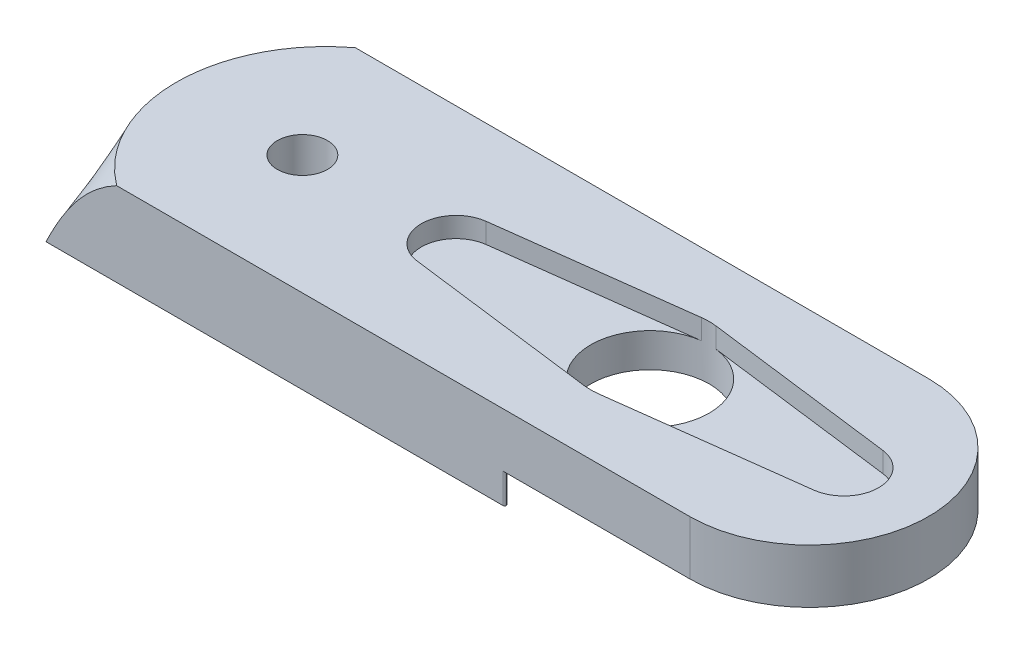
ISO-10303-21;
HEADER;
FILE_DESCRIPTION(('STEP AP214'),'2;1');
FILE_NAME('part.step','',(''),(''),'','','');
FILE_SCHEMA(('AUTOMOTIVE_DESIGN { 1 0 10303 214 1 1 1 1 }'));
ENDSEC;
DATA;
#1=APPLICATION_CONTEXT('core data for automotive mechanical design processes');
#2=APPLICATION_PROTOCOL_DEFINITION('international standard','automotive_design',2000,#1);
#3=PRODUCT_CONTEXT('',#1,'mechanical');
#4=PRODUCT('Part','Part','',(#3));
#5=PRODUCT_RELATED_PRODUCT_CATEGORY('part','',(#4));
#6=PRODUCT_DEFINITION_FORMATION('','',#4);
#7=PRODUCT_DEFINITION_CONTEXT('part definition',#1,'design');
#8=PRODUCT_DEFINITION('design','',#6,#7);
#9=PRODUCT_DEFINITION_SHAPE('','',#8);
#10=(LENGTH_UNIT() NAMED_UNIT(*) SI_UNIT(.MILLI.,.METRE.));
#11=(NAMED_UNIT(*) PLANE_ANGLE_UNIT() SI_UNIT($,.RADIAN.));
#12=(NAMED_UNIT(*) SI_UNIT($,.STERADIAN.) SOLID_ANGLE_UNIT());
#13=UNCERTAINTY_MEASURE_WITH_UNIT(LENGTH_MEASURE(1.E-05),#10,'distance_accuracy_value','');
#14=(GEOMETRIC_REPRESENTATION_CONTEXT(3) GLOBAL_UNCERTAINTY_ASSIGNED_CONTEXT((#13)) GLOBAL_UNIT_ASSIGNED_CONTEXT((#10,
#11,#12)) REPRESENTATION_CONTEXT('',''));
#15=CARTESIAN_POINT('',(0.,0.,0.));
#16=DIRECTION('',(0.,0.,1.));
#17=DIRECTION('',(1.,0.,0.));
#18=AXIS2_PLACEMENT_3D('',#15,#16,#17);
#19=CARTESIAN_POINT('',(30.8202954743875,49.190050083,-19.05));
#20=DIRECTION('',(0.,0.,-1.));
#21=DIRECTION('',(-1.,0.,0.));
#22=AXIS2_PLACEMENT_3D('',#19,#20,#21);
#23=PLANE('',#22);
#24=CARTESIAN_POINT('',(0.,53.499999934,-19.05));
#25=CARTESIAN_POINT('',(-0.142824092213235,53.4243099136071,-19.05));
#26=CARTESIAN_POINT('',(-0.283707079291157,53.3449592423254,-19.05));
#27=CARTESIAN_POINT('',(-0.560962515003241,53.1793399896116,-19.05));
#28=CARTESIAN_POINT('',(-0.697343456728937,53.093085626591,-19.05));
#29=CARTESIAN_POINT('',(-0.965393748981425,52.9138562119458,-19.05));
#30=CARTESIAN_POINT('',(-1.09706817879952,52.8208887539382,-19.05));
#31=CARTESIAN_POINT('',(-1.35557773518331,52.6285417561318,-19.05));
#32=CARTESIAN_POINT('',(-1.48241439864206,52.5291642801682,-19.05));
#33=CARTESIAN_POINT('',(-1.72837370541895,52.3266777041201,-19.05));
#34=CARTESIAN_POINT('',(-1.84760511643531,52.2237005275356,-19.05));
#35=CARTESIAN_POINT('',(-2.08131719091356,52.0124245604322,-19.05));
#36=CARTESIAN_POINT('',(-2.19579635012208,51.9041241082486,-19.05));
#37=CARTESIAN_POINT('',(-2.42002009735384,51.6826827511787,-19.05));
#38=CARTESIAN_POINT('',(-2.52976354570287,51.5695406940382,-19.05));
#39=CARTESIAN_POINT('',(-2.74457202709733,51.3389410931143,-19.05));
#40=CARTESIAN_POINT('',(-2.84963774970837,51.2214841900929,-19.05));
#41=CARTESIAN_POINT('',(-3.08832062881481,50.9443259062265,-19.05));
#42=CARTESIAN_POINT('',(-3.22026162322082,50.783179797612,-19.05));
#43=CARTESIAN_POINT('',(-3.47678619290874,50.4551306267397,-19.05));
#44=CARTESIAN_POINT('',(-3.60136892847071,50.2882269108567,-19.05));
#45=CARTESIAN_POINT('',(-3.8438216433234,49.9494502555842,-19.05));
#46=CARTESIAN_POINT('',(-3.9616868684627,49.7775739235255,-19.05));
#47=CARTESIAN_POINT('',(-4.19129330169751,49.4296103612051,-19.05));
#48=CARTESIAN_POINT('',(-4.30302994941141,49.2535201315792,-19.05));
#49=CARTESIAN_POINT('',(-4.52434376632393,48.8922586100192,-19.05));
#50=CARTESIAN_POINT('',(-4.6337396094512,48.7069765327379,-19.05));
#51=CARTESIAN_POINT('',(-4.84711835845197,48.3334551811599,-19.05));
#52=CARTESIAN_POINT('',(-4.95110399586638,48.1452174628676,-19.05));
#53=CARTESIAN_POINT('',(-5.1541276329912,47.766521970688,-19.05));
#54=CARTESIAN_POINT('',(-5.25317391493549,47.5760686221914,-19.05));
#55=CARTESIAN_POINT('',(-5.44671223556488,47.1936302337995,-19.05));
#56=CARTESIAN_POINT('',(-5.5412179275074,47.0016521115995,-19.05));
#57=CARTESIAN_POINT('',(-5.63387031773936,46.808800083,-19.05));
#58=B_SPLINE_CURVE_WITH_KNOTS('',3,(#24,#25,#26,#27,#28,#29,#30,#31,#32,#33,#34,#35,#36,#37,#38,
#39,#40,#41,#42,#43,#44,#45,#46,#47,#48,#49,#50,#51,#52,#53,#54,#55,#56,#57),.UNSPECIFIED.,.F.,
.F.,(4,2,2,2,2,2,2,2,2,2,2,2,2,2,2,2,4),(0.,0.484867849199377,0.968761594593897,
1.45211630135862,1.93531615169657,2.40778278099106,2.88039783950148,3.35312600818879,
3.82578425747352,4.45034902559084,5.07498493148202,5.70005755433242,6.32558916437343,
6.97098985747166,7.6160614696542,8.26001232106838,8.90188709440173),.UNSPECIFIED.);
#59=CARTESIAN_POINT('',(0.,53.499999934,-19.05000625));
#60=VERTEX_POINT('',#59);
#61=CARTESIAN_POINT('',(-5.63387031773936,46.808800083,-19.05));
#62=VERTEX_POINT('',#61);
#63=EDGE_CURVE('E248',#60,#62,#58,.T.);
#64=ORIENTED_EDGE('',*,*,#63,.F.);
#65=CARTESIAN_POINT('',(9.52500000000001,53.499999934,-19.05));
#66=DIRECTION('',(-1.,0.,0.));
#67=VECTOR('',#66,1.);
#68=LINE('',#65,#67);
#69=CARTESIAN_POINT('',(9.52500000000001,53.499999934,-19.05));
#70=VERTEX_POINT('',#69);
#71=EDGE_CURVE('E298',#70,#60,#68,.T.);
#72=ORIENTED_EDGE('',*,*,#71,.F.);
#73=DIRECTION('',(-1.,0.,0.));
#74=VECTOR('',#73,1.);
#75=CARTESIAN_POINT('',(0.,53.499999934,-19.05));
#76=LINE('',#75,#74);
#77=CARTESIAN_POINT('',(45.72,53.499999934,-19.05));
#78=VERTEX_POINT('',#77);
#79=EDGE_CURVE('E286',#78,#70,#76,.T.);
#80=ORIENTED_EDGE('',*,*,#79,.F.);
#81=DIRECTION('',(0.,1.,0.));
#82=VECTOR('',#81,1.);
#83=CARTESIAN_POINT('',(45.72,17.5367464310951,-19.05));
#84=LINE('',#83,#82);
#85=CARTESIAN_POINT('',(45.72,49.190050083,-19.05));
#86=VERTEX_POINT('',#85);
#87=EDGE_CURVE('E274',#86,#78,#84,.T.);
#88=ORIENTED_EDGE('',*,*,#87,.F.);
#89=DIRECTION('',(1.,0.,0.));
#90=VECTOR('',#89,1.);
#91=CARTESIAN_POINT('',(45.7200000000001,49.190050083,-19.05));
#92=LINE('',#91,#90);
#93=CARTESIAN_POINT('',(30.8202954743875,49.190050083,-19.05));
#94=VERTEX_POINT('',#93);
#95=EDGE_CURVE('E182',#94,#86,#92,.T.);
#96=ORIENTED_EDGE('',*,*,#95,.F.);
#97=DIRECTION('',(0.,-1.,0.));
#98=VECTOR('',#97,1.);
#99=CARTESIAN_POINT('',(30.8202954743875,53.499999934,-19.05));
#100=LINE('',#99,#98);
#101=CARTESIAN_POINT('',(30.8202954743875,46.808800083,-19.05));
#102=VERTEX_POINT('',#101);
#103=EDGE_CURVE('E257',#94,#102,#100,.T.);
#104=ORIENTED_EDGE('',*,*,#103,.T.);
#105=DIRECTION('',(-1.,0.,0.));
#106=VECTOR('',#105,1.);
#107=CARTESIAN_POINT('',(0.,46.808800083,-19.05));
#108=LINE('',#107,#106);
#109=EDGE_CURVE('E276',#102,#62,#108,.T.);
#110=ORIENTED_EDGE('',*,*,#109,.T.);
#111=EDGE_LOOP('',(#64,#72,#80,#88,#96,#104,#110));
#112=FACE_BOUND('',#111,.T.);
#113=ADVANCED_FACE('F37',(#112),#23,.T.);
#114=CARTESIAN_POINT('',(30.8492389549877,46.808800083,-0.250657894736843));
#115=DIRECTION('',(0.,-1.,0.));
#116=DIRECTION('',(0.,0.,-1.));
#117=AXIS2_PLACEMENT_3D('',#114,#115,#116);
#118=PLANE('',#117);
#119=CARTESIAN_POINT('',(5.29312945265254,46.808800083,-9.52499999999645));
#120=DIRECTION('',(0.,-1.,0.));
#121=DIRECTION('',(0.,0.,-1.));
#122=AXIS2_PLACEMENT_3D('',#119,#120,#121);
#123=CIRCLE('',#122,1.99999999999999);
#124=CARTESIAN_POINT('',(5.29312945265254,46.808800083,-11.5249999999964));
#125=VERTEX_POINT('',#124);
#126=EDGE_CURVE('E337',#125,#125,#123,.T.);
#127=ORIENTED_EDGE('',*,*,#126,.F.);
#128=EDGE_LOOP('',(#127));
#129=FACE_BOUND('',#128,.T.);
#130=CARTESIAN_POINT('',(-5.63387031774083,46.808800083,-19.0499999999929));
#131=CARTESIAN_POINT('',(-5.67883247737737,46.808800083,-18.8343207649077));
#132=CARTESIAN_POINT('',(-5.7222392338692,46.808800083,-18.6183172069429));
#133=CARTESIAN_POINT('',(-5.80593044232488,46.808800083,-18.1857153636521));
#134=CARTESIAN_POINT('',(-5.8462150237716,46.808800083,-17.9691171033758));
#135=CARTESIAN_POINT('',(-5.96237122104704,46.808800083,-17.3184979297653));
#136=CARTESIAN_POINT('',(-6.03354812702812,46.808800083,-16.8836390139528));
#137=CARTESIAN_POINT('',(-6.22862254336791,46.808800083,-15.5758904275822));
#138=CARTESIAN_POINT('',(-6.33399878041494,46.808800083,-14.700141879974));
#139=CARTESIAN_POINT('',(-6.45525488451322,46.808800083,-13.3831996168743));
#140=CARTESIAN_POINT('',(-6.48954142575201,46.808800083,-12.9435947651001));
#141=CARTESIAN_POINT('',(-6.54577760202832,46.808800083,-12.0635798021005));
#142=CARTESIAN_POINT('',(-6.56772730798943,46.808800083,-11.6231696955191));
#143=CARTESIAN_POINT('',(-6.59892844138822,46.808800083,-10.7493110819962));
#144=CARTESIAN_POINT('',(-6.60838697770993,46.808800083,-10.3158699037701));
#145=CARTESIAN_POINT('',(-6.61508391249123,46.808800083,-9.44889409386989));
#146=CARTESIAN_POINT('',(-6.61232236883656,46.808800083,-9.01535946264814));
#147=CARTESIAN_POINT('',(-6.59467434613991,46.808800083,-8.14867150898365));
#148=CARTESIAN_POINT('',(-6.57979168922646,46.808800083,-7.71551810942384));
#149=CARTESIAN_POINT('',(-6.5380627319321,46.808800083,-6.8497994708474));
#150=CARTESIAN_POINT('',(-6.51121628631656,46.808800083,-6.41723423903479));
#151=CARTESIAN_POINT('',(-6.41289546306449,46.808800083,-5.12139693856703));
#152=CARTESIAN_POINT('',(-6.32362717951879,46.808800083,-4.25938646392952));
#153=CARTESIAN_POINT('',(-6.13573923356415,46.808800083,-2.83155746163193));
#154=CARTESIAN_POINT('',(-6.05043799307968,46.808800083,-2.26393838898869));
#155=CARTESIAN_POINT('',(-5.85835889334025,46.808800083,-1.13014111844092));
#156=CARTESIAN_POINT('',(-5.75150108370354,46.808800083,-0.563976473994279));
#157=CARTESIAN_POINT('',(-5.63387031773935,46.808800083,0.));
#158=B_SPLINE_CURVE_WITH_KNOTS('',3,(#130,#131,#132,#133,#134,#135,#136,#137,#138,#139,#140,
#141,#142,#143,#144,#145,#146,#147,#148,#149,#150,#151,#152,#153,#154,#155,#156,#157),
.UNSPECIFIED.,.F.,.F.,(4,2,2,2,2,2,2,2,2,2,2,2,2,4),(0.,0.660942325679882,1.32185722607055,
2.64364533774028,5.28817912422191,6.61087087355802,7.9335550187546,9.23402106828043,
10.5344809575879,11.834530933945,13.1345966927138,15.7329397607394,17.4545617030089,
19.1826903498687),.UNSPECIFIED.);
#159=CARTESIAN_POINT('',(-5.63387031773935,46.808800083,0.));
#160=VERTEX_POINT('',#159);
#161=EDGE_CURVE('E44',#62,#160,#158,.T.);
#162=ORIENTED_EDGE('',*,*,#161,.F.);
#163=ORIENTED_EDGE('',*,*,#109,.F.);
#164=CARTESIAN_POINT('',(30.8202954743875,46.808800083,-18.923));
#165=DIRECTION('',(0.,1.,0.));
#166=DIRECTION('',(0.,0.,1.));
#167=AXIS2_PLACEMENT_3D('',#164,#165,#166);
#168=CIRCLE('',#167,0.127);
#169=CARTESIAN_POINT('',(30.8492389549877,46.808800083,-18.7993421052632));
#170=VERTEX_POINT('',#169);
#171=EDGE_CURVE('E266',#102,#170,#168,.F.);
#172=ORIENTED_EDGE('',*,*,#171,.T.);
#173=CARTESIAN_POINT('',(33.02,46.808800083,-9.525));
#174=DIRECTION('',(0.,-1.,0.));
#175=DIRECTION('',(0.,0.,-1.));
#176=AXIS2_PLACEMENT_3D('',#173,#174,#175);
#177=CIRCLE('',#176,9.525);
#178=CARTESIAN_POINT('',(30.8492389549877,46.808800083,-0.250657894736843));
#179=VERTEX_POINT('',#178);
#180=EDGE_CURVE('E11',#179,#170,#177,.T.);
#181=ORIENTED_EDGE('',*,*,#180,.F.);
#182=CARTESIAN_POINT('',(30.8202954743875,46.808800083,-0.127));
#183=DIRECTION('',(0.,1.,0.));
#184=DIRECTION('',(0.,0.,1.));
#185=AXIS2_PLACEMENT_3D('',#182,#183,#184);
#186=CIRCLE('',#185,0.127);
#187=CARTESIAN_POINT('',(30.8202954743875,46.808800083,0.));
#188=VERTEX_POINT('',#187);
#189=EDGE_CURVE('E263',#179,#188,#186,.F.);
#190=ORIENTED_EDGE('',*,*,#189,.T.);
#191=DIRECTION('',(-1.,0.,0.));
#192=VECTOR('',#191,1.);
#193=CARTESIAN_POINT('',(9.52500000000001,46.808800083,0.));
#194=LINE('',#193,#192);
#195=EDGE_CURVE('E270',#188,#160,#194,.T.);
#196=ORIENTED_EDGE('',*,*,#195,.T.);
#197=EDGE_LOOP('',(#162,#163,#172,#181,#190,#196));
#198=FACE_BOUND('',#197,.T.);
#199=ADVANCED_FACE('F209',(#129,#198),#118,.T.);
#200=CARTESIAN_POINT('',(30.8202954743875,46.808800083,0.));
#201=DIRECTION('',(0.,0.,1.));
#202=DIRECTION('',(1.,0.,0.));
#203=AXIS2_PLACEMENT_3D('',#200,#201,#202);
#204=PLANE('',#203);
#205=CARTESIAN_POINT('',(-5.63387031773935,46.808800083,0.));
#206=CARTESIAN_POINT('',(-5.53368623342911,47.0173194216757,0.));
#207=CARTESIAN_POINT('',(-5.43133904949095,47.2248225493173,0.));
#208=CARTESIAN_POINT('',(-5.22118450448037,47.6382502946474,0.));
#209=CARTESIAN_POINT('',(-5.11335407463031,47.8441631694407,0.));
#210=CARTESIAN_POINT('',(-4.89173540748727,48.2534398914354,0.));
#211=CARTESIAN_POINT('',(-4.77793286482719,48.4567960230483,0.));
#212=CARTESIAN_POINT('',(-4.54377645964704,48.8599218997045,0.));
#213=CARTESIAN_POINT('',(-4.42341765326063,49.0596887829434,0.));
#214=CARTESIAN_POINT('',(-4.17970761623702,49.4478390488748,0.));
#215=CARTESIAN_POINT('',(-4.05660369198403,49.6363772166557,0.));
#216=CARTESIAN_POINT('',(-3.80299038255778,50.0081230115674,0.));
#217=CARTESIAN_POINT('',(-3.67248926261061,50.1913362551151,0.));
#218=CARTESIAN_POINT('',(-3.40337004968078,50.5513975944051,0.));
#219=CARTESIAN_POINT('',(-3.26476131913839,50.7282526655302,0.));
#220=CARTESIAN_POINT('',(-2.97866831428998,51.0745503730093,0.));
#221=CARTESIAN_POINT('',(-2.83118784038601,51.2439961303357,0.));
#222=CARTESIAN_POINT('',(-2.58361637519331,51.5125736126757,0.));
#223=CARTESIAN_POINT('',(-2.4863807241827,51.6143461819171,0.));
#224=CARTESIAN_POINT('',(-2.28810406081744,51.8141640571713,0.));
#225=CARTESIAN_POINT('',(-2.18706230032587,51.9122086227089,0.));
#226=CARTESIAN_POINT('',(-1.98116639864321,52.1041941303412,0.));
#227=CARTESIAN_POINT('',(-1.87631260612272,52.1981354460212,0.));
#228=CARTESIAN_POINT('',(-1.66281613362787,52.3815771135582,0.));
#229=CARTESIAN_POINT('',(-1.55417408702983,52.4710782017928,0.));
#230=CARTESIAN_POINT('',(-1.33080440943543,52.6472002415046,0.));
#231=CARTESIAN_POINT('',(-1.21599649907271,52.7337194864537,0.));
#232=CARTESIAN_POINT('',(-0.982599180787647,52.9015492756301,0.));
#233=CARTESIAN_POINT('',(-0.864009050846323,52.9828588163116,0.));
#234=CARTESIAN_POINT('',(-0.623178079485868,53.1400655913847,0.));
#235=CARTESIAN_POINT('',(-0.500934804689872,53.2159590987419,0.));
#236=CARTESIAN_POINT('',(-0.252976096687141,53.3622063021313,0.));
#237=CARTESIAN_POINT('',(-0.127256590006545,53.432553091652,0.));
#238=CARTESIAN_POINT('',(0.,53.499999934,0.));
#239=B_SPLINE_CURVE_WITH_KNOTS('',3,(#205,#206,#207,#208,#209,#210,#211,#212,#213,#214,#215,
#216,#217,#218,#219,#220,#221,#222,#223,#224,#225,#226,#227,#228,#229,#230,#231,#232,#233,#234,
#235,#236,#237,#238),.UNSPECIFIED.,.F.,.F.,(4,2,2,2,2,2,2,2,2,2,2,2,2,2,2,2,4),(0.,
0.694032087665056,1.39127480086992,2.09027153439872,2.78980285867784,3.46515019268505,
4.13975726096967,4.81360012879346,5.48715636915705,5.90933847295858,6.33160399928932,
6.75383099945394,7.17598774080865,7.607120888115,8.038336836487,8.46984671973751,
8.90188568151876),.UNSPECIFIED.);
#240=CARTESIAN_POINT('',(0.,53.499999934,0.));
#241=VERTEX_POINT('',#240);
#242=EDGE_CURVE('E245',#160,#241,#239,.T.);
#243=ORIENTED_EDGE('',*,*,#242,.F.);
#244=ORIENTED_EDGE('',*,*,#195,.F.);
#245=DIRECTION('',(0.,-1.,0.));
#246=VECTOR('',#245,1.);
#247=CARTESIAN_POINT('',(30.8202954743875,53.499999934,0.));
#248=LINE('',#247,#246);
#249=CARTESIAN_POINT('',(30.8202954743875,49.190050083,0.));
#250=VERTEX_POINT('',#249);
#251=EDGE_CURVE('E260',#188,#250,#248,.F.);
#252=ORIENTED_EDGE('',*,*,#251,.T.);
#253=DIRECTION('',(-1.,0.,0.));
#254=VECTOR('',#253,1.);
#255=CARTESIAN_POINT('',(45.72,49.190050083,0.));
#256=LINE('',#255,#254);
#257=CARTESIAN_POINT('',(45.72,49.190050083,0.));
#258=VERTEX_POINT('',#257);
#259=EDGE_CURVE('E187',#258,#250,#256,.T.);
#260=ORIENTED_EDGE('',*,*,#259,.F.);
#261=DIRECTION('',(0.,1.,0.));
#262=VECTOR('',#261,1.);
#263=CARTESIAN_POINT('',(45.72,17.5367464310951,0.));
#264=LINE('',#263,#262);
#265=CARTESIAN_POINT('',(45.72,53.499999934,0.));
#266=VERTEX_POINT('',#265);
#267=EDGE_CURVE('E290',#258,#266,#264,.T.);
#268=ORIENTED_EDGE('',*,*,#267,.T.);
#269=DIRECTION('',(1.,0.,0.));
#270=VECTOR('',#269,1.);
#271=CARTESIAN_POINT('',(0.,53.499999934,0.));
#272=LINE('',#271,#270);
#273=CARTESIAN_POINT('',(9.52500000000001,53.499999934,0.));
#274=VERTEX_POINT('',#273);
#275=EDGE_CURVE('E275',#274,#266,#272,.T.);
#276=ORIENTED_EDGE('',*,*,#275,.F.);
#277=CARTESIAN_POINT('',(9.52500000000001,53.499999934,0.));
#278=DIRECTION('',(-1.,0.,0.));
#279=VECTOR('',#278,1.);
#280=LINE('',#277,#279);
#281=EDGE_CURVE('E242',#274,#241,#280,.T.);
#282=ORIENTED_EDGE('',*,*,#281,.T.);
#283=EDGE_LOOP('',(#243,#244,#252,#260,#268,#276,#282));
#284=FACE_BOUND('',#283,.T.);
#285=ADVANCED_FACE('F212',(#284),#204,.T.);
#286=CARTESIAN_POINT('',(48.8380781067962,54.0240628376615,-6.77570559819935));
#287=DIRECTION('',(0.126213592233009,0.,0.992003089277266));
#288=DIRECTION('',(0.,-1.,0.));
#289=AXIS2_PLACEMENT_3D('',#286,#287,#288);
#290=PLANE('',#289);
#291=DIRECTION('',(0.992003089277266,0.,-0.126213592233009));
#292=VECTOR('',#291,1.);
#293=CARTESIAN_POINT('',(33.6162033495146,53.499999934,-4.83901052698018));
#294=LINE('',#293,#292);
#295=CARTESIAN_POINT('',(33.6162033495146,53.499999934,-4.83901052698018));
#296=VERTEX_POINT('',#295);
#297=CARTESIAN_POINT('',(48.8380781067962,53.499999934,-6.77570559819935));
#298=VERTEX_POINT('',#297);
#299=EDGE_CURVE('E355',#296,#298,#294,.T.);
#300=ORIENTED_EDGE('',*,*,#299,.T.);
#301=DIRECTION('',(0.,-1.,0.));
#302=VECTOR('',#301,1.);
#303=CARTESIAN_POINT('',(48.8380781067962,54.0240628376615,-6.77570559819935));
#304=LINE('',#303,#302);
#305=CARTESIAN_POINT('',(48.8380781067962,51.8942728376614,-6.77570559819935));
#306=VERTEX_POINT('',#305);
#307=EDGE_CURVE('E136',#298,#306,#304,.T.);
#308=ORIENTED_EDGE('',*,*,#307,.T.);
#309=DIRECTION('',(-0.992003089277266,0.,0.126213592233009));
#310=VECTOR('',#309,1.);
#311=CARTESIAN_POINT('',(33.6162033495146,51.8942728376615,-4.83901052698018));
#312=LINE('',#311,#310);
#313=CARTESIAN_POINT('',(33.6162033495146,51.8942728376615,-4.83901052698018));
#314=VERTEX_POINT('',#313);
#315=EDGE_CURVE('E116',#306,#314,#312,.T.);
#316=ORIENTED_EDGE('',*,*,#315,.T.);
#317=DIRECTION('',(0.,-1.,0.));
#318=VECTOR('',#317,1.);
#319=CARTESIAN_POINT('',(33.6162033495146,52.4130678376615,-4.83901052698018));
#320=LINE('',#319,#318);
#321=EDGE_CURVE('E126',#296,#314,#320,.T.);
#322=ORIENTED_EDGE('',*,*,#321,.F.);
#323=EDGE_LOOP('',(#300,#308,#316,#322));
#324=FACE_BOUND('',#323,.T.);
#325=ADVANCED_FACE('F139',(#324),#290,.F.);
#326=CARTESIAN_POINT('',(48.4882825,54.0240628376615,-9.52499999999998));
#327=DIRECTION('',(0.,-1.,0.));
#328=DIRECTION('',(0.126213592233009,0.,0.992003089277266));
#329=AXIS2_PLACEMENT_3D('',#326,#327,#328);
#330=CYLINDRICAL_SURFACE('',#329,2.7714575);
#331=CARTESIAN_POINT('',(48.4882825,53.499999934,-9.52499999999998));
#332=DIRECTION('',(0.,1.,0.));
#333=DIRECTION('',(0.,0.,1.));
#334=AXIS2_PLACEMENT_3D('',#331,#332,#333);
#335=CIRCLE('',#334,2.7714575);
#336=CARTESIAN_POINT('',(48.8380781067961,53.499999934,-12.2742944018006));
#337=VERTEX_POINT('',#336);
#338=EDGE_CURVE('E354',#298,#337,#335,.T.);
#339=ORIENTED_EDGE('',*,*,#338,.T.);
#340=DIRECTION('',(0.,-1.,0.));
#341=VECTOR('',#340,1.);
#342=CARTESIAN_POINT('',(48.8380781067961,54.0240628376615,-12.2742944018006));
#343=LINE('',#342,#341);
#344=CARTESIAN_POINT('',(48.8380781067961,51.8942728376614,-12.2742944018006));
#345=VERTEX_POINT('',#344);
#346=EDGE_CURVE('E152',#337,#345,#343,.T.);
#347=ORIENTED_EDGE('',*,*,#346,.T.);
#348=CARTESIAN_POINT('',(48.4882825,51.8942728376614,-9.52499999999998));
#349=DIRECTION('',(0.,-1.,0.));
#350=DIRECTION('',(0.126213592233009,0.,0.992003089277266));
#351=AXIS2_PLACEMENT_3D('',#348,#349,#350);
#352=CIRCLE('',#351,2.7714575);
#353=EDGE_CURVE('E142',#345,#306,#352,.T.);
#354=ORIENTED_EDGE('',*,*,#353,.T.);
#355=ORIENTED_EDGE('',*,*,#307,.F.);
#356=EDGE_LOOP('',(#339,#347,#354,#355));
#357=FACE_BOUND('',#356,.T.);
#358=ADVANCED_FACE('F415',(#357),#330,.F.);
#359=CARTESIAN_POINT('',(33.02,51.8942728376615,-9.525));
#360=DIRECTION('',(0.,1.,0.));
#361=DIRECTION('',(0.,0.,-1.));
#362=AXIS2_PLACEMENT_3D('',#359,#360,#361);
#363=PLANE('',#362);
#364=ORIENTED_EDGE('',*,*,#315,.F.);
#365=ORIENTED_EDGE('',*,*,#353,.F.);
#366=DIRECTION('',(0.992003089277266,0.,0.126213592233011));
#367=VECTOR('',#366,1.);
#368=CARTESIAN_POINT('',(48.8380781067961,51.8942728376614,-12.2742944018006));
#369=LINE('',#368,#367);
#370=CARTESIAN_POINT('',(33.6162033495146,51.8942728376615,-14.2109894730198));
#371=VERTEX_POINT('',#370);
#372=EDGE_CURVE('E118',#371,#345,#369,.T.);
#373=ORIENTED_EDGE('',*,*,#372,.F.);
#374=CARTESIAN_POINT('',(33.02,51.8942728376615,-9.525));
#375=DIRECTION('',(0.,-1.,0.));
#376=DIRECTION('',(-1.,0.,0.));
#377=AXIS2_PLACEMENT_3D('',#374,#375,#376);
#378=CIRCLE('',#377,4.723765);
#379=EDGE_CURVE('E111',#371,#314,#378,.T.);
#380=ORIENTED_EDGE('',*,*,#379,.T.);
#381=EDGE_LOOP('',(#364,#365,#373,#380));
#382=FACE_BOUND('',#381,.T.);
#383=ADVANCED_FACE('F113',(#382),#363,.T.);
#384=CARTESIAN_POINT('',(17.2019218932039,54.0240628376615,-12.2742944018007));
#385=DIRECTION('',(-0.126213592233009,0.,-0.992003089277266));
#386=DIRECTION('',(0.,1.,0.));
#387=AXIS2_PLACEMENT_3D('',#384,#385,#386);
#388=PLANE('',#387);
#389=DIRECTION('',(-0.992003089277266,0.,0.126213592233009));
#390=VECTOR('',#389,1.);
#391=CARTESIAN_POINT('',(32.4237966504854,53.499999934,-14.2109894730198));
#392=LINE('',#391,#390);
#393=CARTESIAN_POINT('',(32.4237966504855,53.499999934,-14.2109894730198));
#394=VERTEX_POINT('',#393);
#395=CARTESIAN_POINT('',(17.2019218932039,53.499999934,-12.2742944018007));
#396=VERTEX_POINT('',#395);
#397=EDGE_CURVE('E372',#394,#396,#392,.T.);
#398=ORIENTED_EDGE('',*,*,#397,.T.);
#399=DIRECTION('',(0.,-1.,0.));
#400=VECTOR('',#399,1.);
#401=CARTESIAN_POINT('',(17.2019218932039,54.0240628376615,-12.2742944018007));
#402=LINE('',#401,#400);
#403=CARTESIAN_POINT('',(17.2019218932039,51.8942728376615,-12.2742944018007));
#404=VERTEX_POINT('',#403);
#405=EDGE_CURVE('E171',#396,#404,#402,.T.);
#406=ORIENTED_EDGE('',*,*,#405,.T.);
#407=DIRECTION('',(0.992003089277266,0.,-0.126213592233009));
#408=VECTOR('',#407,1.);
#409=CARTESIAN_POINT('',(32.4237966504855,51.8942728376615,-14.2109894730198));
#410=LINE('',#409,#408);
#411=CARTESIAN_POINT('',(32.4237966504855,51.8942728376615,-14.2109894730198));
#412=VERTEX_POINT('',#411);
#413=EDGE_CURVE('E122',#404,#412,#410,.T.);
#414=ORIENTED_EDGE('',*,*,#413,.T.);
#415=DIRECTION('',(0.,-1.,0.));
#416=VECTOR('',#415,1.);
#417=CARTESIAN_POINT('',(32.4237966504855,52.4130678376615,-14.2109894730198));
#418=LINE('',#417,#416);
#419=EDGE_CURVE('E149',#394,#412,#418,.T.);
#420=ORIENTED_EDGE('',*,*,#419,.F.);
#421=EDGE_LOOP('',(#398,#406,#414,#420));
#422=FACE_BOUND('',#421,.T.);
#423=ADVANCED_FACE('F420',(#422),#388,.F.);
#424=CARTESIAN_POINT('',(17.5517175,54.0240628376615,-9.52500000000002));
#425=DIRECTION('',(0.,-1.,0.));
#426=DIRECTION('',(-0.126213592233009,0.,-0.992003089277266));
#427=AXIS2_PLACEMENT_3D('',#424,#425,#426);
#428=CYLINDRICAL_SURFACE('',#427,2.7714575);
#429=CARTESIAN_POINT('',(17.5517175,53.499999934,-9.52500000000002));
#430=DIRECTION('',(0.,1.,0.));
#431=DIRECTION('',(0.,0.,1.));
#432=AXIS2_PLACEMENT_3D('',#429,#430,#431);
#433=CIRCLE('',#432,2.7714575);
#434=CARTESIAN_POINT('',(17.2019218932039,53.499999934,-6.77570559819936));
#435=VERTEX_POINT('',#434);
#436=EDGE_CURVE('E375',#396,#435,#433,.T.);
#437=ORIENTED_EDGE('',*,*,#436,.T.);
#438=DIRECTION('',(0.,-1.,0.));
#439=VECTOR('',#438,1.);
#440=CARTESIAN_POINT('',(17.2019218932039,54.0240628376615,-6.77570559819936));
#441=LINE('',#440,#439);
#442=CARTESIAN_POINT('',(17.2019218932039,51.8942728376615,-6.77570559819936));
#443=VERTEX_POINT('',#442);
#444=EDGE_CURVE('E170',#435,#443,#441,.T.);
#445=ORIENTED_EDGE('',*,*,#444,.T.);
#446=CARTESIAN_POINT('',(17.5517175,51.8942728376615,-9.52500000000002));
#447=DIRECTION('',(0.,-1.,0.));
#448=DIRECTION('',(-0.126213592233009,0.,-0.992003089277266));
#449=AXIS2_PLACEMENT_3D('',#446,#447,#448);
#450=CIRCLE('',#449,2.7714575);
#451=EDGE_CURVE('E156',#443,#404,#450,.T.);
#452=ORIENTED_EDGE('',*,*,#451,.T.);
#453=ORIENTED_EDGE('',*,*,#405,.F.);
#454=EDGE_LOOP('',(#437,#445,#452,#453));
#455=FACE_BOUND('',#454,.T.);
#456=ADVANCED_FACE('F427',(#455),#428,.F.);
#457=CARTESIAN_POINT('',(33.02,51.8942728376615,-9.525));
#458=DIRECTION('',(0.,1.,0.));
#459=DIRECTION('',(0.,0.,-1.));
#460=AXIS2_PLACEMENT_3D('',#457,#458,#459);
#461=PLANE('',#460);
#462=CARTESIAN_POINT('',(33.02,51.8942728376615,-9.525));
#463=DIRECTION('',(0.,-1.,0.));
#464=DIRECTION('',(-1.,0.,0.));
#465=AXIS2_PLACEMENT_3D('',#462,#463,#464);
#466=CIRCLE('',#465,4.723765);
#467=CARTESIAN_POINT('',(32.4237966504855,51.8942728376615,-4.83901052698018));
#468=VERTEX_POINT('',#467);
#469=EDGE_CURVE('E103',#468,#412,#466,.T.);
#470=ORIENTED_EDGE('',*,*,#469,.T.);
#471=ORIENTED_EDGE('',*,*,#413,.F.);
#472=ORIENTED_EDGE('',*,*,#451,.F.);
#473=DIRECTION('',(-0.992003089277266,0.,-0.126213592233011));
#474=VECTOR('',#473,1.);
#475=CARTESIAN_POINT('',(17.2019218932039,51.8942728376615,-6.77570559819936));
#476=LINE('',#475,#474);
#477=EDGE_CURVE('E159',#468,#443,#476,.T.);
#478=ORIENTED_EDGE('',*,*,#477,.F.);
#479=EDGE_LOOP('',(#470,#471,#472,#478));
#480=FACE_BOUND('',#479,.T.);
#481=ADVANCED_FACE('F431',(#480),#461,.T.);
#482=CARTESIAN_POINT('',(33.02,52.4130678376615,-9.525));
#483=DIRECTION('',(0.,-1.,0.));
#484=DIRECTION('',(-1.,0.,0.));
#485=AXIS2_PLACEMENT_3D('',#482,#483,#484);
#486=CYLINDRICAL_SURFACE('',#485,4.723765);
#487=CARTESIAN_POINT('',(33.02,53.499999934,-9.525));
#488=DIRECTION('',(0.,1.,0.));
#489=DIRECTION('',(0.,0.,1.));
#490=AXIS2_PLACEMENT_3D('',#487,#488,#489);
#491=CIRCLE('',#490,4.723765);
#492=CARTESIAN_POINT('',(33.6162033495146,53.499999934,-14.2109894730198));
#493=VERTEX_POINT('',#492);
#494=EDGE_CURVE('E365',#493,#394,#491,.T.);
#495=ORIENTED_EDGE('',*,*,#494,.T.);
#496=ORIENTED_EDGE('',*,*,#419,.T.);
#497=ORIENTED_EDGE('',*,*,#469,.F.);
#498=DIRECTION('',(0.,-1.,0.));
#499=VECTOR('',#498,1.);
#500=CARTESIAN_POINT('',(32.4237966504855,52.4130678376615,-4.83901052698018));
#501=LINE('',#500,#499);
#502=CARTESIAN_POINT('',(32.4237966504855,53.499999934,-4.83901052698018));
#503=VERTEX_POINT('',#502);
#504=EDGE_CURVE('E74',#503,#468,#501,.T.);
#505=ORIENTED_EDGE('',*,*,#504,.F.);
#506=EDGE_CURVE('E131',#503,#296,#491,.T.);
#507=ORIENTED_EDGE('',*,*,#506,.T.);
#508=ORIENTED_EDGE('',*,*,#321,.T.);
#509=ORIENTED_EDGE('',*,*,#379,.F.);
#510=DIRECTION('',(0.,-1.,0.));
#511=VECTOR('',#510,1.);
#512=CARTESIAN_POINT('',(33.6162033495146,52.4130678376615,-14.2109894730198));
#513=LINE('',#512,#511);
#514=EDGE_CURVE('E162',#493,#371,#513,.T.);
#515=ORIENTED_EDGE('',*,*,#514,.F.);
#516=EDGE_LOOP('',(#495,#496,#497,#505,#507,#508,#509,#515));
#517=FACE_BOUND('',#516,.T.);
#518=CARTESIAN_POINT('',(33.02,49.190050083,-9.525));
#519=DIRECTION('',(0.,-1.,0.));
#520=DIRECTION('',(0.,0.,-1.));
#521=AXIS2_PLACEMENT_3D('',#518,#519,#520);
#522=CIRCLE('',#521,4.723765);
#523=CARTESIAN_POINT('',(33.02,49.190050083,-14.248765));
#524=VERTEX_POINT('',#523);
#525=EDGE_CURVE('E179',#524,#524,#522,.F.);
#526=ORIENTED_EDGE('',*,*,#525,.F.);
#527=EDGE_LOOP('',(#526));
#528=FACE_BOUND('',#527,.T.);
#529=ADVANCED_FACE('F128',(#517,#528),#486,.F.);
#530=CARTESIAN_POINT('',(45.72,17.5367464310951,-9.525));
#531=DIRECTION('',(0.,1.,0.));
#532=DIRECTION('',(0.,0.,1.));
#533=AXIS2_PLACEMENT_3D('',#530,#531,#532);
#534=CYLINDRICAL_SURFACE('',#533,9.525);
#535=ORIENTED_EDGE('',*,*,#267,.F.);
#536=CARTESIAN_POINT('',(45.72,49.190050083,-9.525));
#537=DIRECTION('',(0.,-1.,0.));
#538=DIRECTION('',(0.,0.,-1.));
#539=AXIS2_PLACEMENT_3D('',#536,#537,#538);
#540=CIRCLE('',#539,9.525);
#541=EDGE_CURVE('E54',#86,#258,#540,.T.);
#542=ORIENTED_EDGE('',*,*,#541,.F.);
#543=ORIENTED_EDGE('',*,*,#87,.T.);
#544=CARTESIAN_POINT('',(45.72,53.499999934,-9.525));
#545=DIRECTION('',(0.,1.,0.));
#546=DIRECTION('',(0.,0.,-1.));
#547=AXIS2_PLACEMENT_3D('',#544,#545,#546);
#548=CIRCLE('',#547,9.525);
#549=EDGE_CURVE('E293',#266,#78,#548,.T.);
#550=ORIENTED_EDGE('',*,*,#549,.F.);
#551=EDGE_LOOP('',(#535,#542,#543,#550));
#552=FACE_BOUND('',#551,.T.);
#553=ADVANCED_FACE('F394',(#552),#534,.T.);
#554=CARTESIAN_POINT('',(33.02,49.190050083,-9.525));
#555=DIRECTION('',(0.,-1.,0.));
#556=DIRECTION('',(0.,0.,-1.));
#557=AXIS2_PLACEMENT_3D('',#554,#555,#556);
#558=CYLINDRICAL_SURFACE('',#557,9.525);
#559=CARTESIAN_POINT('',(33.02,49.190050083,-9.525));
#560=DIRECTION('',(0.,-1.,0.));
#561=DIRECTION('',(0.,0.,-1.));
#562=AXIS2_PLACEMENT_3D('',#559,#560,#561);
#563=CIRCLE('',#562,9.525);
#564=CARTESIAN_POINT('',(30.8492389549877,49.190050083,-0.250657894736843));
#565=VERTEX_POINT('',#564);
#566=CARTESIAN_POINT('',(30.8492389549877,49.190050083,-18.7993421052632));
#567=VERTEX_POINT('',#566);
#568=EDGE_CURVE('E184',#565,#567,#563,.T.);
#569=ORIENTED_EDGE('',*,*,#568,.F.);
#570=DIRECTION('',(0.,-1.,0.));
#571=VECTOR('',#570,1.);
#572=CARTESIAN_POINT('',(30.8492389549877,49.190050083,-0.250657894736843));
#573=LINE('',#572,#571);
#574=EDGE_CURVE('E269',#565,#179,#573,.T.);
#575=ORIENTED_EDGE('',*,*,#574,.T.);
#576=ORIENTED_EDGE('',*,*,#180,.T.);
#577=DIRECTION('',(0.,-1.,0.));
#578=VECTOR('',#577,1.);
#579=CARTESIAN_POINT('',(30.8492389549877,49.190050083,-18.7993421052632));
#580=LINE('',#579,#578);
#581=EDGE_CURVE('E363',#170,#567,#580,.F.);
#582=ORIENTED_EDGE('',*,*,#581,.T.);
#583=EDGE_LOOP('',(#569,#575,#576,#582));
#584=FACE_BOUND('',#583,.T.);
#585=ADVANCED_FACE('F413',(#584),#558,.F.);
#586=CARTESIAN_POINT('',(45.72,49.190050083,-9.525));
#587=DIRECTION('',(0.,-1.,0.));
#588=DIRECTION('',(0.,0.,-1.));
#589=AXIS2_PLACEMENT_3D('',#586,#587,#588);
#590=PLANE('',#589);
#591=ORIENTED_EDGE('',*,*,#541,.T.);
#592=ORIENTED_EDGE('',*,*,#259,.T.);
#593=CARTESIAN_POINT('',(30.8202954743875,49.190050083,-0.127));
#594=DIRECTION('',(0.,-1.,0.));
#595=DIRECTION('',(0.,0.,-1.));
#596=AXIS2_PLACEMENT_3D('',#593,#594,#595);
#597=CIRCLE('',#596,0.127);
#598=EDGE_CURVE('E254',#250,#565,#597,.F.);
#599=ORIENTED_EDGE('',*,*,#598,.T.);
#600=ORIENTED_EDGE('',*,*,#568,.T.);
#601=CARTESIAN_POINT('',(30.8202954743875,49.190050083,-18.923));
#602=DIRECTION('',(0.,-1.,0.));
#603=DIRECTION('',(0.,0.,-1.));
#604=AXIS2_PLACEMENT_3D('',#601,#602,#603);
#605=CIRCLE('',#604,0.127);
#606=EDGE_CURVE('E251',#567,#94,#605,.F.);
#607=ORIENTED_EDGE('',*,*,#606,.T.);
#608=ORIENTED_EDGE('',*,*,#95,.T.);
#609=EDGE_LOOP('',(#591,#592,#599,#600,#607,#608));
#610=FACE_BOUND('',#609,.T.);
#611=ORIENTED_EDGE('',*,*,#525,.T.);
#612=EDGE_LOOP('',(#611));
#613=FACE_BOUND('',#612,.T.);
#614=ADVANCED_FACE('F213',(#610,#613),#590,.T.);
#615=CARTESIAN_POINT('',(30.8202954743875,49.190050083,-18.923));
#616=DIRECTION('',(0.,-1.,0.));
#617=DIRECTION('',(0.,0.,-1.));
#618=AXIS2_PLACEMENT_3D('',#615,#616,#617);
#619=CYLINDRICAL_SURFACE('',#618,0.127);
#620=ORIENTED_EDGE('',*,*,#606,.F.);
#621=ORIENTED_EDGE('',*,*,#581,.F.);
#622=ORIENTED_EDGE('',*,*,#171,.F.);
#623=ORIENTED_EDGE('',*,*,#103,.F.);
#624=EDGE_LOOP('',(#620,#621,#622,#623));
#625=FACE_BOUND('',#624,.T.);
#626=ADVANCED_FACE('F445',(#625),#619,.T.);
#627=CARTESIAN_POINT('',(30.8202954743875,49.190050083,-0.127));
#628=DIRECTION('',(0.,-1.,0.));
#629=DIRECTION('',(0.,0.,-1.));
#630=AXIS2_PLACEMENT_3D('',#627,#628,#629);
#631=CYLINDRICAL_SURFACE('',#630,0.127);
#632=ORIENTED_EDGE('',*,*,#598,.F.);
#633=ORIENTED_EDGE('',*,*,#251,.F.);
#634=ORIENTED_EDGE('',*,*,#189,.F.);
#635=ORIENTED_EDGE('',*,*,#574,.F.);
#636=EDGE_LOOP('',(#632,#633,#634,#635));
#637=FACE_BOUND('',#636,.T.);
#638=ADVANCED_FACE('F392',(#637),#631,.T.);
#639=CARTESIAN_POINT('',(32.4237966504855,54.0240628376615,-4.83901052698018));
#640=DIRECTION('',(-0.126213592233011,0.,0.992003089277266));
#641=DIRECTION('',(0.,1.,0.));
#642=AXIS2_PLACEMENT_3D('',#639,#640,#641);
#643=PLANE('',#642);
#644=DIRECTION('',(0.992003089277266,0.,0.126213592233011));
#645=VECTOR('',#644,1.);
#646=CARTESIAN_POINT('',(32.4237966504854,53.499999934,-4.83901052698019));
#647=LINE('',#646,#645);
#648=EDGE_CURVE('E378',#435,#503,#647,.T.);
#649=ORIENTED_EDGE('',*,*,#648,.T.);
#650=ORIENTED_EDGE('',*,*,#504,.T.);
#651=ORIENTED_EDGE('',*,*,#477,.T.);
#652=ORIENTED_EDGE('',*,*,#444,.F.);
#653=EDGE_LOOP('',(#649,#650,#651,#652));
#654=FACE_BOUND('',#653,.T.);
#655=ADVANCED_FACE('F423',(#654),#643,.F.);
#656=CARTESIAN_POINT('',(33.6162033495146,54.0240628376615,-14.2109894730198));
#657=DIRECTION('',(0.126213592233011,0.,-0.992003089277266));
#658=DIRECTION('',(0.992003089277266,0.,0.126213592233011));
#659=AXIS2_PLACEMENT_3D('',#656,#657,#658);
#660=PLANE('',#659);
#661=DIRECTION('',(-0.992003089277266,0.,-0.126213592233011));
#662=VECTOR('',#661,1.);
#663=CARTESIAN_POINT('',(33.6162033495146,53.499999934,-14.2109894730198));
#664=LINE('',#663,#662);
#665=EDGE_CURVE('E359',#337,#493,#664,.T.);
#666=ORIENTED_EDGE('',*,*,#665,.T.);
#667=ORIENTED_EDGE('',*,*,#514,.T.);
#668=ORIENTED_EDGE('',*,*,#372,.T.);
#669=ORIENTED_EDGE('',*,*,#346,.F.);
#670=EDGE_LOOP('',(#666,#667,#668,#669));
#671=FACE_BOUND('',#670,.T.);
#672=ADVANCED_FACE('F349',(#671),#660,.F.);
#673=CARTESIAN_POINT('',(33.02,53.499999934,-9.525));
#674=DIRECTION('',(0.,1.,0.));
#675=DIRECTION('',(0.,0.,1.));
#676=AXIS2_PLACEMENT_3D('',#673,#674,#675);
#677=PLANE('',#676);
#678=CARTESIAN_POINT('',(5.29312945265254,53.499999934,-9.52499999999645));
#679=DIRECTION('',(0.,1.,0.));
#680=DIRECTION('',(0.,0.,1.));
#681=AXIS2_PLACEMENT_3D('',#678,#679,#680);
#682=CIRCLE('',#681,1.99999999999999);
#683=CARTESIAN_POINT('',(5.29312945265254,53.499999934,-7.52499999999646));
#684=VERTEX_POINT('',#683);
#685=EDGE_CURVE('E339',#684,#684,#682,.T.);
#686=ORIENTED_EDGE('',*,*,#685,.F.);
#687=EDGE_LOOP('',(#686));
#688=FACE_BOUND('',#687,.T.);
#689=ORIENTED_EDGE('',*,*,#338,.F.);
#690=ORIENTED_EDGE('',*,*,#299,.F.);
#691=ORIENTED_EDGE('',*,*,#506,.F.);
#692=ORIENTED_EDGE('',*,*,#648,.F.);
#693=ORIENTED_EDGE('',*,*,#436,.F.);
#694=ORIENTED_EDGE('',*,*,#397,.F.);
#695=ORIENTED_EDGE('',*,*,#494,.F.);
#696=ORIENTED_EDGE('',*,*,#665,.F.);
#697=EDGE_LOOP('',(#689,#690,#691,#692,#693,#694,#695,#696));
#698=FACE_BOUND('',#697,.T.);
#699=ORIENTED_EDGE('',*,*,#79,.T.);
#700=ORIENTED_EDGE('',*,*,#71,.T.);
#701=CARTESIAN_POINT('',(0.,53.499999934,0.));
#702=CARTESIAN_POINT('',(-0.736040572022364,53.499999934,-0.552030429016774));
#703=CARTESIAN_POINT('',(-2.07855157469198,53.4999999339999,-1.82802270146736));
#704=CARTESIAN_POINT('',(-4.11120782443589,53.4999999340002,-4.92605042753363));
#705=CARTESIAN_POINT('',(-5.19829273751082,53.4999999339999,-9.52500000000003));
#706=CARTESIAN_POINT('',(-4.11120782443589,53.4999999339999,-14.1239495724664));
#707=CARTESIAN_POINT('',(-2.07855157469199,53.4999999340001,-17.2219772985327));
#708=CARTESIAN_POINT('',(-0.736040572022365,53.499999934,-18.4979695709832));
#709=CARTESIAN_POINT('',(0.,53.499999934,-19.05));
#710=B_SPLINE_CURVE_WITH_KNOTS('',3,(#701,#702,#703,#704,#705,#706,#707,#708,#709),
.UNSPECIFIED.,.F.,.F.,(4,1,1,1,1,1,4),(0.604326571428496,0.653785749999934,0.703244928571372,
0.802163285714248,0.901081642857124,0.950540821428562,1.),.UNSPECIFIED.);
#711=EDGE_CURVE('E164',#60,#241,#710,.F.);
#712=ORIENTED_EDGE('',*,*,#711,.T.);
#713=ORIENTED_EDGE('',*,*,#281,.F.);
#714=ORIENTED_EDGE('',*,*,#275,.T.);
#715=ORIENTED_EDGE('',*,*,#549,.T.);
#716=EDGE_LOOP('',(#699,#700,#712,#713,#714,#715));
#717=FACE_BOUND('',#716,.T.);
#718=ADVANCED_FACE('F322',(#688,#698,#717),#677,.T.);
#719=CARTESIAN_POINT('',(-9.52500000000001,36.275,-36.275000094));
#720=CARTESIAN_POINT('',(-6.35,42.0166666446667,-30.533333396));
#721=CARTESIAN_POINT('',(-3.175,47.7583332893333,-24.791666698));
#722=CARTESIAN_POINT('',(0.,53.499999934,-19.05));
#723=CARTESIAN_POINT('',(-9.52500000000001,36.275,-34.0458334195));
#724=CARTESIAN_POINT('',(-6.59534685734079,42.0166666446667,-28.8632121366611));
#725=CARTESIAN_POINT('',(-3.66569371468158,47.7583332893333,-23.6805908538222));
#726=CARTESIAN_POINT('',(-0.736040572022365,53.499999934,-18.4979695709832));
#727=CARTESIAN_POINT('',(-9.52500000000001,36.275,-29.5875000705));
#728=CARTESIAN_POINT('',(-7.04285052489733,42.0166666446667,-25.4656591465109));
#729=CARTESIAN_POINT('',(-4.56070104979466,47.7583332893334,-21.3438182225218));
#730=CARTESIAN_POINT('',(-2.07855157469199,53.4999999340001,-17.2219772985327));
#731=CARTESIAN_POINT('',(-9.52500000000001,36.275,-20.6708333725));
#732=CARTESIAN_POINT('',(-7.72040260814531,42.0166666446667,-18.4885387724888));
#733=CARTESIAN_POINT('',(-5.9158052162906,47.7583332893333,-16.3062441724776));
#734=CARTESIAN_POINT('',(-4.11120782443589,53.4999999339999,-14.1239495724664));
#735=CARTESIAN_POINT('',(-9.52499999999999,36.275,-9.525));
#736=CARTESIAN_POINT('',(-8.08276424583694,42.0166666446666,-9.52500000000001));
#737=CARTESIAN_POINT('',(-6.64052849167388,47.7583332893333,-9.52500000000002));
#738=CARTESIAN_POINT('',(-5.19829273751082,53.4999999339999,-9.52500000000003));
#739=CARTESIAN_POINT('',(-9.52500000000001,36.275,1.62083337250001));
#740=CARTESIAN_POINT('',(-7.72040260814531,42.0166666446667,-0.561461227511203));
#741=CARTESIAN_POINT('',(-5.9158052162906,47.7583332893334,-2.74375582752241));
#742=CARTESIAN_POINT('',(-4.11120782443589,53.4999999340002,-4.92605042753363));
#743=CARTESIAN_POINT('',(-9.52500000000001,36.275,10.5375000705));
#744=CARTESIAN_POINT('',(-7.04285052489733,42.0166666446666,6.41565914651088));
#745=CARTESIAN_POINT('',(-4.56070104979465,47.7583332893332,2.29381822252176));
#746=CARTESIAN_POINT('',(-2.07855157469198,53.4999999339999,-1.82802270146736));
#747=CARTESIAN_POINT('',(-9.52500000000001,36.275,14.9958334195));
#748=CARTESIAN_POINT('',(-6.59534685734079,42.0166666446667,9.81321213666107));
#749=CARTESIAN_POINT('',(-3.66569371468158,47.7583332893333,4.63059085382215));
#750=CARTESIAN_POINT('',(-0.736040572022364,53.499999934,-0.552030429016774));
#751=CARTESIAN_POINT('',(-9.52500000000001,36.275,17.225000094));
#752=CARTESIAN_POINT('',(-6.35,42.0166666446667,11.483333396));
#753=CARTESIAN_POINT('',(-3.175,47.7583332893333,5.741666698));
#754=CARTESIAN_POINT('',(0.,53.499999934,0.));
#755=B_SPLINE_SURFACE_WITH_KNOTS('',3,3,((#719,#720,#721,#722),(#723,#724,#725,#726),(#727,#728,
#729,#730),(#731,#732,#733,#734),(#735,#736,#737,#738),(#739,#740,#741,#742),(#743,#744,#745,
#746),(#747,#748,#749,#750),(#751,#752,#753,#754)),.UNSPECIFIED.,.F.,.F.,.F.,(4,1,1,1,1,1,4),(4,
4),(0.604326571428496,0.653785749999934,0.703244928571372,0.802163285714248,0.901081642857124,
0.950540821428562,1.),(0.,1.),.UNSPECIFIED.);
#756=ORIENTED_EDGE('',*,*,#63,.T.);
#757=ORIENTED_EDGE('',*,*,#161,.T.);
#758=ORIENTED_EDGE('',*,*,#242,.T.);
#759=ORIENTED_EDGE('',*,*,#711,.F.);
#760=EDGE_LOOP('',(#756,#757,#758,#759));
#761=FACE_BOUND('',#760,.T.);
#762=ADVANCED_FACE('F39',(#761),#755,.T.);
#763=CARTESIAN_POINT('',(5.29312945265254,33.9769458665076,-9.52499999999645));
#764=DIRECTION('',(0.,1.,0.));
#765=DIRECTION('',(0.,0.,1.));
#766=AXIS2_PLACEMENT_3D('',#763,#764,#765);
#767=CYLINDRICAL_SURFACE('',#766,1.99999999999999);
#768=ORIENTED_EDGE('',*,*,#126,.T.);
#769=EDGE_LOOP('',(#768));
#770=FACE_BOUND('',#769,.T.);
#771=ORIENTED_EDGE('',*,*,#685,.T.);
#772=EDGE_LOOP('',(#771));
#773=FACE_BOUND('',#772,.T.);
#774=ADVANCED_FACE('F211',(#770,#773),#767,.F.);
#775=CLOSED_SHELL('',(#113,#199,#285,#325,#358,#383,#423,#456,#481,#529,#553,#585,#614,#626,
#638,#655,#672,#718,#762,#774));
#776=MANIFOLD_SOLID_BREP('B2',#775);
#777=ADVANCED_BREP_SHAPE_REPRESENTATION('',(#18,#776),#14);
#778=SHAPE_DEFINITION_REPRESENTATION(#9,#777);
ENDSEC;
END-ISO-10303-21;
